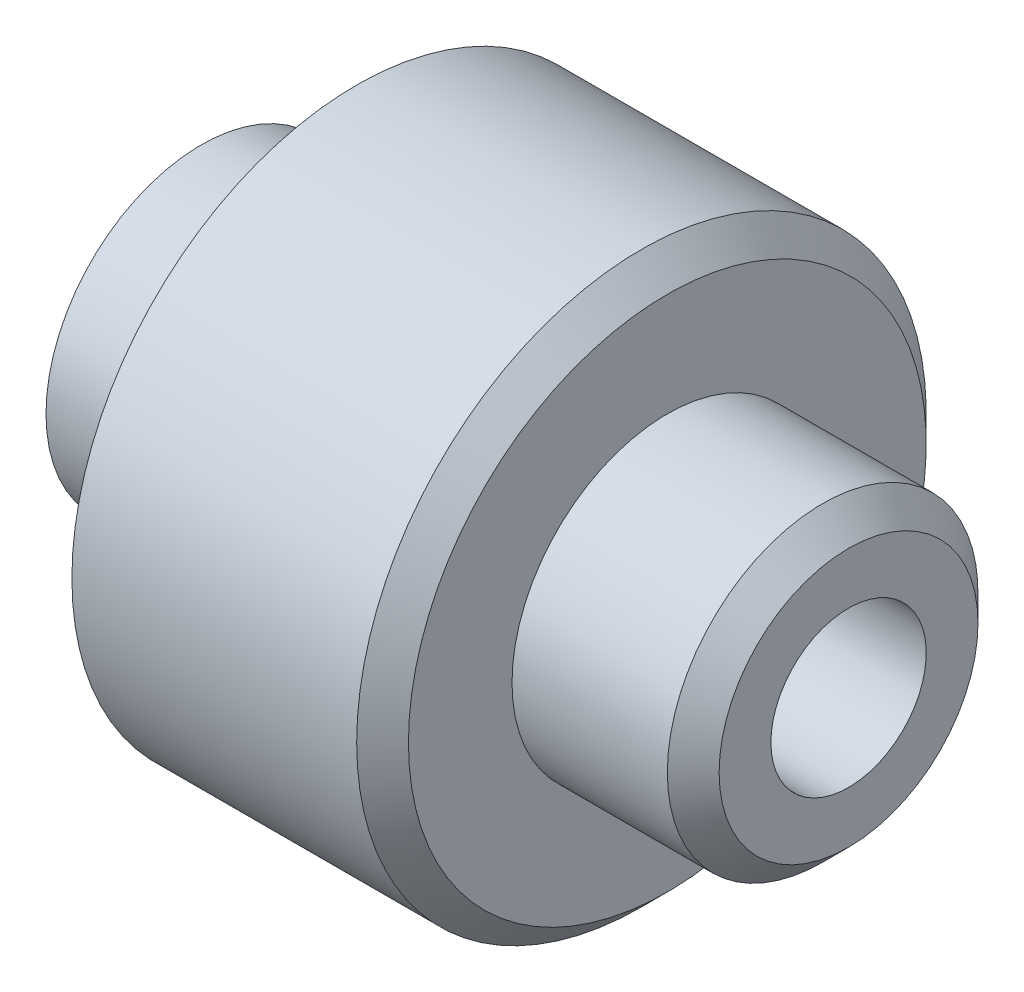
ISO-10303-21;
HEADER;
FILE_DESCRIPTION(('STEP AP214'),'2;1');
FILE_NAME('part.step','',(''),(''),'','','');
FILE_SCHEMA(('AUTOMOTIVE_DESIGN { 1 0 10303 214 1 1 1 1 }'));
ENDSEC;
DATA;
#1=APPLICATION_CONTEXT('core data for automotive mechanical design processes');
#2=APPLICATION_PROTOCOL_DEFINITION('international standard','automotive_design',2000,#1);
#3=PRODUCT_CONTEXT('',#1,'mechanical');
#4=PRODUCT('Part','Part','',(#3));
#5=PRODUCT_RELATED_PRODUCT_CATEGORY('part','',(#4));
#6=PRODUCT_DEFINITION_FORMATION('','',#4);
#7=PRODUCT_DEFINITION_CONTEXT('part definition',#1,'design');
#8=PRODUCT_DEFINITION('design','',#6,#7);
#9=PRODUCT_DEFINITION_SHAPE('','',#8);
#10=(LENGTH_UNIT() NAMED_UNIT(*) SI_UNIT(.MILLI.,.METRE.));
#11=(NAMED_UNIT(*) PLANE_ANGLE_UNIT() SI_UNIT($,.RADIAN.));
#12=(NAMED_UNIT(*) SI_UNIT($,.STERADIAN.) SOLID_ANGLE_UNIT());
#13=UNCERTAINTY_MEASURE_WITH_UNIT(LENGTH_MEASURE(1.E-05),#10,'distance_accuracy_value','');
#14=(GEOMETRIC_REPRESENTATION_CONTEXT(3) GLOBAL_UNCERTAINTY_ASSIGNED_CONTEXT((#13)) GLOBAL_UNIT_ASSIGNED_CONTEXT((#10,
#11,#12)) REPRESENTATION_CONTEXT('',''));
#15=CARTESIAN_POINT('',(0.,0.,0.));
#16=DIRECTION('',(0.,0.,1.));
#17=DIRECTION('',(1.,0.,0.));
#18=AXIS2_PLACEMENT_3D('',#15,#16,#17);
#19=CARTESIAN_POINT('',(8.,0.,0.));
#20=DIRECTION('',(-1.,0.,0.));
#21=DIRECTION('',(0.,0.,1.));
#22=AXIS2_PLACEMENT_3D('',#19,#20,#21);
#23=CONICAL_SURFACE('',#22,10.,0.785398163397448);
#24=CARTESIAN_POINT('',(8.,0.,0.));
#25=DIRECTION('',(-1.,0.,0.));
#26=DIRECTION('',(0.,0.,1.));
#27=AXIS2_PLACEMENT_3D('',#24,#25,#26);
#28=CIRCLE('',#27,10.);
#29=CARTESIAN_POINT('',(8.,0.,10.));
#30=VERTEX_POINT('',#29);
#31=EDGE_CURVE('E17',#30,#30,#28,.F.);
#32=ORIENTED_EDGE('',*,*,#31,.F.);
#33=EDGE_LOOP('',(#32));
#34=FACE_BOUND('',#33,.T.);
#35=CARTESIAN_POINT('',(7.,0.,0.));
#36=DIRECTION('',(-1.,0.,0.));
#37=DIRECTION('',(0.,-1.,0.));
#38=AXIS2_PLACEMENT_3D('',#35,#36,#37);
#39=CIRCLE('',#38,11.);
#40=CARTESIAN_POINT('',(7.,-11.,0.));
#41=VERTEX_POINT('',#40);
#42=EDGE_CURVE('E48',#41,#41,#39,.F.);
#43=ORIENTED_EDGE('',*,*,#42,.T.);
#44=EDGE_LOOP('',(#43));
#45=FACE_BOUND('',#44,.T.);
#46=ADVANCED_FACE('F13',(#34,#45),#23,.T.);
#47=CARTESIAN_POINT('',(7.,0.,0.));
#48=DIRECTION('',(-1.,0.,0.));
#49=DIRECTION('',(0.,0.,1.));
#50=AXIS2_PLACEMENT_3D('',#47,#48,#49);
#51=CYLINDRICAL_SURFACE('',#50,11.);
#52=ORIENTED_EDGE('',*,*,#42,.F.);
#53=EDGE_LOOP('',(#52));
#54=FACE_BOUND('',#53,.T.);
#55=CARTESIAN_POINT('',(-4.,0.,0.));
#56=DIRECTION('',(-1.,0.,0.));
#57=DIRECTION('',(0.,0.,1.));
#58=AXIS2_PLACEMENT_3D('',#55,#56,#57);
#59=CIRCLE('',#58,11.);
#60=CARTESIAN_POINT('',(-4.,0.,11.));
#61=VERTEX_POINT('',#60);
#62=EDGE_CURVE('E43',#61,#61,#59,.T.);
#63=ORIENTED_EDGE('',*,*,#62,.F.);
#64=EDGE_LOOP('',(#63));
#65=FACE_BOUND('',#64,.T.);
#66=ADVANCED_FACE('F55',(#54,#65),#51,.T.);
#67=CARTESIAN_POINT('',(8.,10.,10.));
#68=DIRECTION('',(1.,0.,0.));
#69=DIRECTION('',(0.,-1.,0.));
#70=AXIS2_PLACEMENT_3D('',#67,#68,#69);
#71=PLANE('',#70);
#72=CARTESIAN_POINT('',(8.,0.,0.));
#73=DIRECTION('',(-1.,0.,0.));
#74=DIRECTION('',(0.,0.,1.));
#75=AXIS2_PLACEMENT_3D('',#72,#73,#74);
#76=CIRCLE('',#75,6.);
#77=CARTESIAN_POINT('',(8.,0.,6.));
#78=VERTEX_POINT('',#77);
#79=EDGE_CURVE('E40',#78,#78,#76,.T.);
#80=ORIENTED_EDGE('',*,*,#79,.T.);
#81=EDGE_LOOP('',(#80));
#82=FACE_BOUND('',#81,.T.);
#83=ORIENTED_EDGE('',*,*,#31,.T.);
#84=EDGE_LOOP('',(#83));
#85=FACE_BOUND('',#84,.T.);
#86=ADVANCED_FACE('F58',(#82,#85),#71,.T.);
#87=CARTESIAN_POINT('',(-4.,11.,-11.));
#88=DIRECTION('',(-1.,0.,0.));
#89=DIRECTION('',(0.,-1.,0.));
#90=AXIS2_PLACEMENT_3D('',#87,#88,#89);
#91=PLANE('',#90);
#92=CARTESIAN_POINT('',(-4.,0.,0.));
#93=DIRECTION('',(-1.,0.,0.));
#94=DIRECTION('',(0.,0.,1.));
#95=AXIS2_PLACEMENT_3D('',#92,#93,#94);
#96=CIRCLE('',#95,6.);
#97=CARTESIAN_POINT('',(-4.,0.,6.));
#98=VERTEX_POINT('',#97);
#99=EDGE_CURVE('E37',#98,#98,#96,.F.);
#100=ORIENTED_EDGE('',*,*,#99,.T.);
#101=EDGE_LOOP('',(#100));
#102=FACE_BOUND('',#101,.T.);
#103=ORIENTED_EDGE('',*,*,#62,.T.);
#104=EDGE_LOOP('',(#103));
#105=FACE_BOUND('',#104,.T.);
#106=ADVANCED_FACE('F65',(#102,#105),#91,.T.);
#107=CARTESIAN_POINT('',(14.,0.,0.));
#108=DIRECTION('',(-1.,0.,0.));
#109=DIRECTION('',(0.,0.,1.));
#110=AXIS2_PLACEMENT_3D('',#107,#108,#109);
#111=CYLINDRICAL_SURFACE('',#110,6.);
#112=CARTESIAN_POINT('',(14.,0.,0.));
#113=DIRECTION('',(-1.,0.,0.));
#114=DIRECTION('',(0.,-1.,0.));
#115=AXIS2_PLACEMENT_3D('',#112,#113,#114);
#116=CIRCLE('',#115,6.);
#117=CARTESIAN_POINT('',(14.,-6.,0.));
#118=VERTEX_POINT('',#117);
#119=EDGE_CURVE('E29',#118,#118,#116,.T.);
#120=ORIENTED_EDGE('',*,*,#119,.T.);
#121=EDGE_LOOP('',(#120));
#122=FACE_BOUND('',#121,.T.);
#123=ORIENTED_EDGE('',*,*,#79,.F.);
#124=EDGE_LOOP('',(#123));
#125=FACE_BOUND('',#124,.T.);
#126=ADVANCED_FACE('F85',(#122,#125),#111,.T.);
#127=CARTESIAN_POINT('',(-4.,0.,0.));
#128=DIRECTION('',(-1.,0.,0.));
#129=DIRECTION('',(0.,0.,1.));
#130=AXIS2_PLACEMENT_3D('',#127,#128,#129);
#131=CYLINDRICAL_SURFACE('',#130,6.);
#132=ORIENTED_EDGE('',*,*,#99,.F.);
#133=EDGE_LOOP('',(#132));
#134=FACE_BOUND('',#133,.T.);
#135=CARTESIAN_POINT('',(-10.,0.,0.));
#136=DIRECTION('',(-1.,0.,0.));
#137=DIRECTION('',(0.,0.,1.));
#138=AXIS2_PLACEMENT_3D('',#135,#136,#137);
#139=CIRCLE('',#138,6.);
#140=CARTESIAN_POINT('',(-10.,0.,6.));
#141=VERTEX_POINT('',#140);
#142=EDGE_CURVE('E34',#141,#141,#139,.T.);
#143=ORIENTED_EDGE('',*,*,#142,.F.);
#144=EDGE_LOOP('',(#143));
#145=FACE_BOUND('',#144,.T.);
#146=ADVANCED_FACE('F92',(#134,#145),#131,.T.);
#147=CARTESIAN_POINT('',(15.,0.,0.));
#148=DIRECTION('',(-1.,0.,0.));
#149=DIRECTION('',(0.,0.,1.));
#150=AXIS2_PLACEMENT_3D('',#147,#148,#149);
#151=CONICAL_SURFACE('',#150,5.,0.785398163397449);
#152=CARTESIAN_POINT('',(15.,0.,0.));
#153=DIRECTION('',(-1.,0.,0.));
#154=DIRECTION('',(0.,0.,1.));
#155=AXIS2_PLACEMENT_3D('',#152,#153,#154);
#156=CIRCLE('',#155,5.);
#157=CARTESIAN_POINT('',(15.,0.,5.));
#158=VERTEX_POINT('',#157);
#159=EDGE_CURVE('E26',#158,#158,#156,.F.);
#160=ORIENTED_EDGE('',*,*,#159,.F.);
#161=EDGE_LOOP('',(#160));
#162=FACE_BOUND('',#161,.T.);
#163=ORIENTED_EDGE('',*,*,#119,.F.);
#164=EDGE_LOOP('',(#163));
#165=FACE_BOUND('',#164,.T.);
#166=ADVANCED_FACE('F81',(#162,#165),#151,.T.);
#167=CARTESIAN_POINT('',(-10.,6.,-6.));
#168=DIRECTION('',(-1.,0.,0.));
#169=DIRECTION('',(0.,-1.,0.));
#170=AXIS2_PLACEMENT_3D('',#167,#168,#169);
#171=PLANE('',#170);
#172=CARTESIAN_POINT('',(-10.,0.,0.));
#173=DIRECTION('',(-1.,0.,0.));
#174=DIRECTION('',(0.,0.,1.));
#175=AXIS2_PLACEMENT_3D('',#172,#173,#174);
#176=CIRCLE('',#175,3.);
#177=CARTESIAN_POINT('',(-10.,0.,2.99999999999999));
#178=VERTEX_POINT('',#177);
#179=EDGE_CURVE('E21',#178,#178,#176,.T.);
#180=ORIENTED_EDGE('',*,*,#179,.F.);
#181=EDGE_LOOP('',(#180));
#182=FACE_BOUND('',#181,.T.);
#183=ORIENTED_EDGE('',*,*,#142,.T.);
#184=EDGE_LOOP('',(#183));
#185=FACE_BOUND('',#184,.T.);
#186=ADVANCED_FACE('F78',(#182,#185),#171,.T.);
#187=CARTESIAN_POINT('',(15.,5.,5.));
#188=DIRECTION('',(1.,0.,0.));
#189=DIRECTION('',(0.,-1.,0.));
#190=AXIS2_PLACEMENT_3D('',#187,#188,#189);
#191=PLANE('',#190);
#192=CARTESIAN_POINT('',(15.,0.,0.));
#193=DIRECTION('',(-1.,0.,0.));
#194=DIRECTION('',(0.,0.,1.));
#195=AXIS2_PLACEMENT_3D('',#192,#193,#194);
#196=CIRCLE('',#195,3.);
#197=CARTESIAN_POINT('',(15.,0.,3.));
#198=VERTEX_POINT('',#197);
#199=EDGE_CURVE('E9',#198,#198,#196,.F.);
#200=ORIENTED_EDGE('',*,*,#199,.F.);
#201=EDGE_LOOP('',(#200));
#202=FACE_BOUND('',#201,.T.);
#203=ORIENTED_EDGE('',*,*,#159,.T.);
#204=EDGE_LOOP('',(#203));
#205=FACE_BOUND('',#204,.T.);
#206=ADVANCED_FACE('F15',(#202,#205),#191,.T.);
#207=CARTESIAN_POINT('',(15.,0.,0.));
#208=DIRECTION('',(-1.,0.,0.));
#209=DIRECTION('',(0.,0.,1.));
#210=AXIS2_PLACEMENT_3D('',#207,#208,#209);
#211=CYLINDRICAL_SURFACE('',#210,3.);
#212=ORIENTED_EDGE('',*,*,#179,.T.);
#213=EDGE_LOOP('',(#212));
#214=FACE_BOUND('',#213,.T.);
#215=ORIENTED_EDGE('',*,*,#199,.T.);
#216=EDGE_LOOP('',(#215));
#217=FACE_BOUND('',#216,.T.);
#218=ADVANCED_FACE('F71',(#214,#217),#211,.F.);
#219=CLOSED_SHELL('',(#46,#66,#86,#106,#126,#146,#166,#186,#206,#218));
#220=MANIFOLD_SOLID_BREP('B1',#219);
#221=ADVANCED_BREP_SHAPE_REPRESENTATION('',(#18,#220),#14);
#222=SHAPE_DEFINITION_REPRESENTATION(#9,#221);
ENDSEC;
END-ISO-10303-21;
